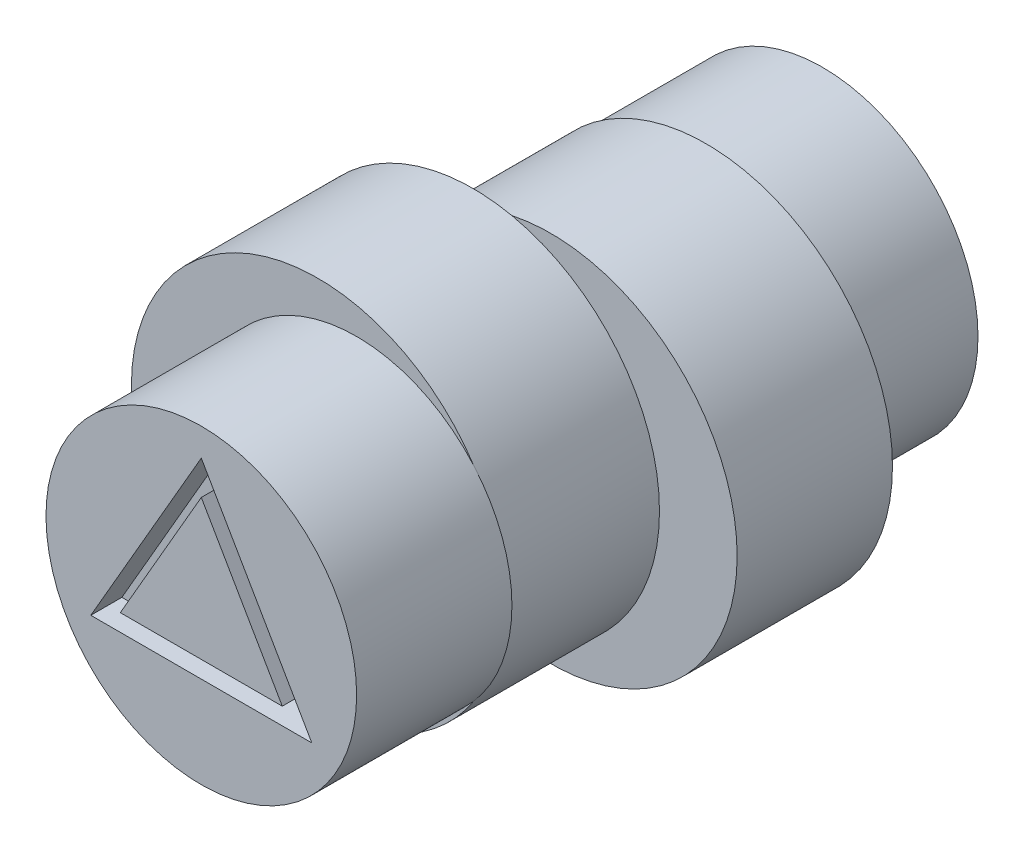
ISO-10303-21;
HEADER;
FILE_DESCRIPTION(('STEP AP214'),'2;1');
FILE_NAME('part.step','',(''),(''),'','','');
FILE_SCHEMA(('AUTOMOTIVE_DESIGN { 1 0 10303 214 1 1 1 1 }'));
ENDSEC;
DATA;
#1=APPLICATION_CONTEXT('core data for automotive mechanical design processes');
#2=APPLICATION_PROTOCOL_DEFINITION('international standard','automotive_design',2000,#1);
#3=PRODUCT_CONTEXT('',#1,'mechanical');
#4=PRODUCT('Part','Part','',(#3));
#5=PRODUCT_RELATED_PRODUCT_CATEGORY('part','',(#4));
#6=PRODUCT_DEFINITION_FORMATION('','',#4);
#7=PRODUCT_DEFINITION_CONTEXT('part definition',#1,'design');
#8=PRODUCT_DEFINITION('design','',#6,#7);
#9=PRODUCT_DEFINITION_SHAPE('','',#8);
#10=(LENGTH_UNIT() NAMED_UNIT(*) SI_UNIT(.MILLI.,.METRE.));
#11=(NAMED_UNIT(*) PLANE_ANGLE_UNIT() SI_UNIT($,.RADIAN.));
#12=(NAMED_UNIT(*) SI_UNIT($,.STERADIAN.) SOLID_ANGLE_UNIT());
#13=UNCERTAINTY_MEASURE_WITH_UNIT(LENGTH_MEASURE(1.E-05),#10,'distance_accuracy_value','');
#14=(GEOMETRIC_REPRESENTATION_CONTEXT(3) GLOBAL_UNCERTAINTY_ASSIGNED_CONTEXT((#13)) GLOBAL_UNIT_ASSIGNED_CONTEXT((#10,
#11,#12)) REPRESENTATION_CONTEXT('',''));
#15=CARTESIAN_POINT('',(0.,0.,0.));
#16=DIRECTION('',(0.,0.,1.));
#17=DIRECTION('',(1.,0.,0.));
#18=AXIS2_PLACEMENT_3D('',#15,#16,#17);
#19=CARTESIAN_POINT('',(2.,1.5,-1142.42938155235));
#20=DIRECTION('',(-1.,0.,0.));
#21=DIRECTION('',(0.,0.,1.));
#22=AXIS2_PLACEMENT_3D('',#19,#20,#21);
#23=PLANE('',#22);
#24=DIRECTION('',(0.,0.,-1.));
#25=VECTOR('',#24,1.);
#26=CARTESIAN_POINT('',(2.,-1.5,-1142.42938155235));
#27=LINE('',#26,#25);
#28=CARTESIAN_POINT('',(2.,-1.5,-1146.18226519916));
#29=VERTEX_POINT('',#28);
#30=CARTESIAN_POINT('',(2.,-1.5,-1161.58226519916));
#31=VERTEX_POINT('',#30);
#32=EDGE_CURVE('E211',#29,#31,#27,.T.);
#33=ORIENTED_EDGE('',*,*,#32,.F.);
#34=DIRECTION('',(0.,1.,0.));
#35=VECTOR('',#34,1.);
#36=CARTESIAN_POINT('',(2.,1.5,-1146.18226519916));
#37=LINE('',#36,#35);
#38=CARTESIAN_POINT('',(2.,1.5,-1146.18226519916));
#39=VERTEX_POINT('',#38);
#40=EDGE_CURVE('E173',#29,#39,#37,.T.);
#41=ORIENTED_EDGE('',*,*,#40,.T.);
#42=DIRECTION('',(0.,0.,-1.));
#43=VECTOR('',#42,1.);
#44=CARTESIAN_POINT('',(2.,1.5,-1142.42938155235));
#45=LINE('',#44,#43);
#46=CARTESIAN_POINT('',(2.,1.5,-1161.58226519916));
#47=VERTEX_POINT('',#46);
#48=EDGE_CURVE('E209',#39,#47,#45,.T.);
#49=ORIENTED_EDGE('',*,*,#48,.T.);
#50=DIRECTION('',(0.,1.,0.));
#51=VECTOR('',#50,1.);
#52=CARTESIAN_POINT('',(2.,1.5,-1161.58226519916));
#53=LINE('',#52,#51);
#54=EDGE_CURVE('E206',#31,#47,#53,.T.);
#55=ORIENTED_EDGE('',*,*,#54,.F.);
#56=EDGE_LOOP('',(#33,#41,#49,#55));
#57=FACE_BOUND('',#56,.T.);
#58=ADVANCED_FACE('F39',(#57),#23,.T.);
#59=CARTESIAN_POINT('',(0.,0.,-1142.42938155235));
#60=DIRECTION('',(0.,0.,-1.));
#61=DIRECTION('',(-1.,0.,0.));
#62=AXIS2_PLACEMENT_3D('',#59,#60,#61);
#63=CYLINDRICAL_SURFACE('',#62,2.5);
#64=ORIENTED_EDGE('',*,*,#48,.F.);
#65=CARTESIAN_POINT('',(0.,0.,-1146.18226519916));
#66=DIRECTION('',(0.,0.,1.));
#67=DIRECTION('',(1.,0.,0.));
#68=AXIS2_PLACEMENT_3D('',#65,#66,#67);
#69=CIRCLE('',#68,2.5);
#70=EDGE_CURVE('E11',#39,#29,#69,.T.);
#71=ORIENTED_EDGE('',*,*,#70,.T.);
#72=ORIENTED_EDGE('',*,*,#32,.T.);
#73=CARTESIAN_POINT('',(0.,0.,-1161.58226519916));
#74=DIRECTION('',(0.,0.,1.));
#75=DIRECTION('',(1.,0.,0.));
#76=AXIS2_PLACEMENT_3D('',#73,#74,#75);
#77=CIRCLE('',#76,2.5);
#78=EDGE_CURVE('E196',#47,#31,#77,.T.);
#79=ORIENTED_EDGE('',*,*,#78,.F.);
#80=EDGE_LOOP('',(#64,#71,#72,#79));
#81=FACE_BOUND('',#80,.T.);
#82=ADVANCED_FACE('F230',(#81),#63,.F.);
#83=CARTESIAN_POINT('',(0.,0.,-1142.42938155235));
#84=DIRECTION('',(0.,0.,-1.));
#85=DIRECTION('',(-1.,0.,0.));
#86=AXIS2_PLACEMENT_3D('',#83,#84,#85);
#87=CYLINDRICAL_SURFACE('',#86,5.00380000000014);
#88=CARTESIAN_POINT('',(0.,0.,-1161.58226519916));
#89=DIRECTION('',(0.,0.,1.));
#90=DIRECTION('',(1.,0.,0.));
#91=AXIS2_PLACEMENT_3D('',#88,#89,#90);
#92=CIRCLE('',#91,5.00380000000014);
#93=CARTESIAN_POINT('',(5.00380000000014,0.,-1161.58226519916));
#94=VERTEX_POINT('',#93);
#95=EDGE_CURVE('E212',#94,#94,#92,.T.);
#96=ORIENTED_EDGE('',*,*,#95,.T.);
#97=EDGE_LOOP('',(#96));
#98=FACE_BOUND('',#97,.T.);
#99=CARTESIAN_POINT('',(0.,0.,-1156.58226519916));
#100=DIRECTION('',(0.,0.,1.));
#101=DIRECTION('',(1.,0.,0.));
#102=AXIS2_PLACEMENT_3D('',#99,#100,#101);
#103=CIRCLE('',#102,5.00380000000014);
#104=CARTESIAN_POINT('',(-3.75979422399943,3.30181190154466,-1156.58226519916));
#105=VERTEX_POINT('',#104);
#106=CARTESIAN_POINT('',(-3.75979422399943,-3.30181190154466,-1156.58226519916));
#107=VERTEX_POINT('',#106);
#108=EDGE_CURVE('E201',#105,#107,#103,.T.);
#109=ORIENTED_EDGE('',*,*,#108,.F.);
#110=EDGE_CURVE('E203',#107,#105,#103,.T.);
#111=ORIENTED_EDGE('',*,*,#110,.F.);
#112=EDGE_LOOP('',(#109,#111));
#113=FACE_BOUND('',#112,.T.);
#114=ADVANCED_FACE('F41',(#98,#113),#87,.T.);
#115=CARTESIAN_POINT('',(0.,0.,-1161.58226519916));
#116=DIRECTION('',(0.,0.,1.));
#117=DIRECTION('',(1.,0.,0.));
#118=AXIS2_PLACEMENT_3D('',#115,#116,#117);
#119=PLANE('',#118);
#120=ORIENTED_EDGE('',*,*,#95,.F.);
#121=EDGE_LOOP('',(#120));
#122=FACE_BOUND('',#121,.T.);
#123=ORIENTED_EDGE('',*,*,#78,.T.);
#124=ORIENTED_EDGE('',*,*,#54,.T.);
#125=EDGE_LOOP('',(#123,#124));
#126=FACE_BOUND('',#125,.T.);
#127=ADVANCED_FACE('F229',(#122,#126),#119,.F.);
#128=CARTESIAN_POINT('',(0.,0.,-1156.58226519916));
#129=DIRECTION('',(0.,0.,1.));
#130=DIRECTION('',(-0.50000000000001,0.866025403784433,0.));
#131=AXIS2_PLACEMENT_3D('',#128,#129,#130);
#132=PLANE('',#131);
#133=CARTESIAN_POINT('',(1.25,0.,-1156.58226519916));
#134=DIRECTION('',(0.,0.,1.));
#135=DIRECTION('',(1.,0.,0.));
#136=AXIS2_PLACEMENT_3D('',#133,#134,#135);
#137=CIRCLE('',#136,6.);
#138=EDGE_CURVE('E198',#105,#107,#137,.T.);
#139=ORIENTED_EDGE('',*,*,#138,.F.);
#140=ORIENTED_EDGE('',*,*,#108,.T.);
#141=EDGE_LOOP('',(#139,#140));
#142=FACE_BOUND('',#141,.T.);
#143=ADVANCED_FACE('F227',(#142),#132,.T.);
#144=CARTESIAN_POINT('',(1.25,0.,-1156.58226519916));
#145=DIRECTION('',(0.,0.,1.));
#146=DIRECTION('',(1.,0.,0.));
#147=AXIS2_PLACEMENT_3D('',#144,#145,#146);
#148=PLANE('',#147);
#149=EDGE_CURVE('E189',#107,#105,#137,.T.);
#150=ORIENTED_EDGE('',*,*,#149,.F.);
#151=ORIENTED_EDGE('',*,*,#110,.T.);
#152=EDGE_LOOP('',(#150,#151));
#153=FACE_BOUND('',#152,.T.);
#154=ADVANCED_FACE('F221',(#153),#148,.F.);
#155=CARTESIAN_POINT('',(1.25,0.,-1151.58226519916));
#156=DIRECTION('',(0.,0.,1.));
#157=DIRECTION('',(1.,0.,0.));
#158=AXIS2_PLACEMENT_3D('',#155,#156,#157);
#159=PLANE('',#158);
#160=CARTESIAN_POINT('',(-1.25,0.,-1151.58226519916));
#161=DIRECTION('',(0.,0.,1.));
#162=DIRECTION('',(1.,0.,0.));
#163=AXIS2_PLACEMENT_3D('',#160,#161,#162);
#164=CIRCLE('',#163,6.);
#165=CARTESIAN_POINT('',(0.,-5.86834729715275,-1151.58226519916));
#166=VERTEX_POINT('',#165);
#167=CARTESIAN_POINT('',(0.,5.86834729715275,-1151.58226519916));
#168=VERTEX_POINT('',#167);
#169=EDGE_CURVE('E47',#166,#168,#164,.T.);
#170=ORIENTED_EDGE('',*,*,#169,.F.);
#171=CARTESIAN_POINT('',(1.25,0.,-1151.58226519916));
#172=DIRECTION('',(0.,0.,1.));
#173=DIRECTION('',(1.,0.,0.));
#174=AXIS2_PLACEMENT_3D('',#171,#172,#173);
#175=CIRCLE('',#174,6.);
#176=EDGE_CURVE('E197',#166,#168,#175,.T.);
#177=ORIENTED_EDGE('',*,*,#176,.T.);
#178=EDGE_LOOP('',(#170,#177));
#179=FACE_BOUND('',#178,.T.);
#180=ADVANCED_FACE('F251',(#179),#159,.T.);
#181=CARTESIAN_POINT('',(1.25,0.,-1151.58226519916));
#182=DIRECTION('',(0.,0.,-1.));
#183=DIRECTION('',(-1.,0.,0.));
#184=AXIS2_PLACEMENT_3D('',#181,#182,#183);
#185=CYLINDRICAL_SURFACE('',#184,6.);
#186=EDGE_CURVE('E193',#168,#166,#175,.T.);
#187=ORIENTED_EDGE('',*,*,#186,.F.);
#188=ORIENTED_EDGE('',*,*,#176,.F.);
#189=EDGE_LOOP('',(#187,#188));
#190=FACE_BOUND('',#189,.T.);
#191=ORIENTED_EDGE('',*,*,#138,.T.);
#192=ORIENTED_EDGE('',*,*,#149,.T.);
#193=EDGE_LOOP('',(#191,#192));
#194=FACE_BOUND('',#193,.T.);
#195=ADVANCED_FACE('F225',(#190,#194),#185,.T.);
#196=CARTESIAN_POINT('',(-1.25,0.,-1151.58226519916));
#197=DIRECTION('',(0.,0.,1.));
#198=DIRECTION('',(1.,0.,0.));
#199=AXIS2_PLACEMENT_3D('',#196,#197,#198);
#200=PLANE('',#199);
#201=EDGE_CURVE('E183',#168,#166,#164,.T.);
#202=ORIENTED_EDGE('',*,*,#201,.F.);
#203=ORIENTED_EDGE('',*,*,#186,.T.);
#204=EDGE_LOOP('',(#202,#203));
#205=FACE_BOUND('',#204,.T.);
#206=ADVANCED_FACE('F250',(#205),#200,.F.);
#207=CARTESIAN_POINT('',(-1.25,0.,-1146.58226519916));
#208=DIRECTION('',(0.,0.,1.));
#209=DIRECTION('',(1.,0.,0.));
#210=AXIS2_PLACEMENT_3D('',#207,#208,#209);
#211=PLANE('',#210);
#212=CARTESIAN_POINT('',(0.,0.,-1146.58226519916));
#213=DIRECTION('',(0.,0.,1.));
#214=DIRECTION('',(1.,0.,0.));
#215=AXIS2_PLACEMENT_3D('',#212,#213,#214);
#216=CIRCLE('',#215,5.);
#217=CARTESIAN_POINT('',(3.775,3.27862394915916,-1146.58226519916));
#218=VERTEX_POINT('',#217);
#219=CARTESIAN_POINT('',(3.775,-3.27862394915916,-1146.58226519916));
#220=VERTEX_POINT('',#219);
#221=EDGE_CURVE('E184',#218,#220,#216,.T.);
#222=ORIENTED_EDGE('',*,*,#221,.F.);
#223=CARTESIAN_POINT('',(-1.25,0.,-1146.58226519916));
#224=DIRECTION('',(0.,0.,1.));
#225=DIRECTION('',(1.,0.,0.));
#226=AXIS2_PLACEMENT_3D('',#223,#224,#225);
#227=CIRCLE('',#226,6.);
#228=EDGE_CURVE('E187',#218,#220,#227,.T.);
#229=ORIENTED_EDGE('',*,*,#228,.T.);
#230=EDGE_LOOP('',(#222,#229));
#231=FACE_BOUND('',#230,.T.);
#232=ADVANCED_FACE('F262',(#231),#211,.T.);
#233=CARTESIAN_POINT('',(-1.25,0.,-1146.58226519916));
#234=DIRECTION('',(0.,0.,-1.));
#235=DIRECTION('',(-1.,0.,0.));
#236=AXIS2_PLACEMENT_3D('',#233,#234,#235);
#237=CYLINDRICAL_SURFACE('',#236,6.);
#238=ORIENTED_EDGE('',*,*,#228,.F.);
#239=EDGE_CURVE('E190',#220,#218,#227,.T.);
#240=ORIENTED_EDGE('',*,*,#239,.F.);
#241=EDGE_LOOP('',(#238,#240));
#242=FACE_BOUND('',#241,.T.);
#243=ORIENTED_EDGE('',*,*,#201,.T.);
#244=ORIENTED_EDGE('',*,*,#169,.T.);
#245=EDGE_LOOP('',(#243,#244));
#246=FACE_BOUND('',#245,.T.);
#247=ADVANCED_FACE('F258',(#242,#246),#237,.T.);
#248=CARTESIAN_POINT('',(0.,0.,-1146.58226519916));
#249=DIRECTION('',(0.,0.,1.));
#250=DIRECTION('',(1.,0.,0.));
#251=AXIS2_PLACEMENT_3D('',#248,#249,#250);
#252=PLANE('',#251);
#253=EDGE_CURVE('E179',#220,#218,#216,.T.);
#254=ORIENTED_EDGE('',*,*,#253,.F.);
#255=ORIENTED_EDGE('',*,*,#239,.T.);
#256=EDGE_LOOP('',(#254,#255));
#257=FACE_BOUND('',#256,.T.);
#258=ADVANCED_FACE('F261',(#257),#252,.F.);
#259=CARTESIAN_POINT('',(0.,0.,-1141.58226519916));
#260=DIRECTION('',(0.,0.,1.));
#261=DIRECTION('',(1.,0.,0.));
#262=AXIS2_PLACEMENT_3D('',#259,#260,#261);
#263=PLANE('',#262);
#264=DIRECTION('',(-0.500000000000004,0.866025403784436,0.));
#265=VECTOR('',#264,1.);
#266=CARTESIAN_POINT('',(3.55727786160005,-2.05379533097704,-1141.58226519916));
#267=LINE('',#266,#265);
#268=CARTESIAN_POINT('',(3.55727786160005,-2.05379533097704,-1141.58226519916));
#269=VERTEX_POINT('',#268);
#270=CARTESIAN_POINT('',(0.,4.10759066195415,-1141.58226519916));
#271=VERTEX_POINT('',#270);
#272=EDGE_CURVE('E54',#269,#271,#267,.T.);
#273=ORIENTED_EDGE('',*,*,#272,.F.);
#274=DIRECTION('',(1.,0.,0.));
#275=VECTOR('',#274,1.);
#276=CARTESIAN_POINT('',(-3.55727786160002,-2.05379533097709,-1141.58226519916));
#277=LINE('',#276,#275);
#278=CARTESIAN_POINT('',(-3.55727786160002,-2.05379533097709,-1141.58226519916));
#279=VERTEX_POINT('',#278);
#280=EDGE_CURVE('E158',#279,#269,#277,.T.);
#281=ORIENTED_EDGE('',*,*,#280,.F.);
#282=DIRECTION('',(-0.499999999999998,-0.86602540378444,0.));
#283=VECTOR('',#282,1.);
#284=CARTESIAN_POINT('',(0.,4.10759066195415,-1141.58226519916));
#285=LINE('',#284,#283);
#286=EDGE_CURVE('E166',#271,#279,#285,.T.);
#287=ORIENTED_EDGE('',*,*,#286,.F.);
#288=EDGE_LOOP('',(#273,#281,#287));
#289=FACE_BOUND('',#288,.T.);
#290=CARTESIAN_POINT('',(0.,0.,-1141.58226519916));
#291=DIRECTION('',(0.,0.,1.));
#292=DIRECTION('',(1.,0.,0.));
#293=AXIS2_PLACEMENT_3D('',#290,#291,#292);
#294=CIRCLE('',#293,5.);
#295=CARTESIAN_POINT('',(5.,0.,-1141.58226519916));
#296=VERTEX_POINT('',#295);
#297=EDGE_CURVE('E180',#296,#296,#294,.T.);
#298=ORIENTED_EDGE('',*,*,#297,.T.);
#299=EDGE_LOOP('',(#298));
#300=FACE_BOUND('',#299,.T.);
#301=ADVANCED_FACE('F273',(#289,#300),#263,.T.);
#302=CARTESIAN_POINT('',(0.,0.,-1141.58226519916));
#303=DIRECTION('',(0.,0.,-1.));
#304=DIRECTION('',(-1.,0.,0.));
#305=AXIS2_PLACEMENT_3D('',#302,#303,#304);
#306=CYLINDRICAL_SURFACE('',#305,5.);
#307=ORIENTED_EDGE('',*,*,#297,.F.);
#308=EDGE_LOOP('',(#307));
#309=FACE_BOUND('',#308,.T.);
#310=ORIENTED_EDGE('',*,*,#221,.T.);
#311=ORIENTED_EDGE('',*,*,#253,.T.);
#312=EDGE_LOOP('',(#310,#311));
#313=FACE_BOUND('',#312,.T.);
#314=ADVANCED_FACE('F270',(#309,#313),#306,.T.);
#315=CARTESIAN_POINT('',(0.,0.,-1146.18226519916));
#316=DIRECTION('',(0.,0.,1.));
#317=DIRECTION('',(1.,0.,0.));
#318=AXIS2_PLACEMENT_3D('',#315,#316,#317);
#319=PLANE('',#318);
#320=ORIENTED_EDGE('',*,*,#40,.F.);
#321=ORIENTED_EDGE('',*,*,#70,.F.);
#322=EDGE_LOOP('',(#320,#321));
#323=FACE_BOUND('',#322,.T.);
#324=ADVANCED_FACE('F272',(#323),#319,.F.);
#325=CARTESIAN_POINT('',(3.55727786160005,-2.05379533097704,-1142.58226519916));
#326=DIRECTION('',(0.866025403784436,0.500000000000004,0.));
#327=DIRECTION('',(-0.500000000000004,0.866025403784436,0.));
#328=AXIS2_PLACEMENT_3D('',#325,#326,#327);
#329=PLANE('',#328);
#330=ORIENTED_EDGE('',*,*,#272,.T.);
#331=DIRECTION('',(0.,0.,1.));
#332=VECTOR('',#331,1.);
#333=CARTESIAN_POINT('',(0.,4.10759066195415,-1142.58226519916));
#334=LINE('',#333,#332);
#335=CARTESIAN_POINT('',(0.,4.10759066195415,-1142.58226519916));
#336=VERTEX_POINT('',#335);
#337=EDGE_CURVE('E164',#336,#271,#334,.T.);
#338=ORIENTED_EDGE('',*,*,#337,.F.);
#339=DIRECTION('',(-0.500000000000004,0.866025403784436,0.));
#340=VECTOR('',#339,1.);
#341=CARTESIAN_POINT('',(3.55727786160005,-2.05379533097704,-1142.58226519916));
#342=LINE('',#341,#340);
#343=CARTESIAN_POINT('',(3.55727786160005,-2.05379533097704,-1142.58226519916));
#344=VERTEX_POINT('',#343);
#345=EDGE_CURVE('E154',#344,#336,#342,.T.);
#346=ORIENTED_EDGE('',*,*,#345,.F.);
#347=DIRECTION('',(0.,0.,1.));
#348=VECTOR('',#347,1.);
#349=CARTESIAN_POINT('',(3.55727786160005,-2.05379533097704,-1142.58226519916));
#350=LINE('',#349,#348);
#351=EDGE_CURVE('E171',#344,#269,#350,.T.);
#352=ORIENTED_EDGE('',*,*,#351,.T.);
#353=EDGE_LOOP('',(#330,#338,#346,#352));
#354=FACE_BOUND('',#353,.T.);
#355=ADVANCED_FACE('F284',(#354),#329,.F.);
#356=CARTESIAN_POINT('',(-3.55727786160002,-2.05379533097709,-1142.58226519916));
#357=DIRECTION('',(0.,-1.,0.));
#358=DIRECTION('',(1.,0.,0.));
#359=AXIS2_PLACEMENT_3D('',#356,#357,#358);
#360=PLANE('',#359);
#361=ORIENTED_EDGE('',*,*,#280,.T.);
#362=ORIENTED_EDGE('',*,*,#351,.F.);
#363=DIRECTION('',(1.,0.,0.));
#364=VECTOR('',#363,1.);
#365=CARTESIAN_POINT('',(-3.55727786160002,-2.05379533097709,-1142.58226519916));
#366=LINE('',#365,#364);
#367=CARTESIAN_POINT('',(-3.55727786160002,-2.05379533097709,-1142.58226519916));
#368=VERTEX_POINT('',#367);
#369=EDGE_CURVE('E161',#368,#344,#366,.T.);
#370=ORIENTED_EDGE('',*,*,#369,.F.);
#371=DIRECTION('',(0.,0.,1.));
#372=VECTOR('',#371,1.);
#373=CARTESIAN_POINT('',(-3.55727786160002,-2.05379533097709,-1142.58226519916));
#374=LINE('',#373,#372);
#375=EDGE_CURVE('E174',#368,#279,#374,.T.);
#376=ORIENTED_EDGE('',*,*,#375,.T.);
#377=EDGE_LOOP('',(#361,#362,#370,#376));
#378=FACE_BOUND('',#377,.T.);
#379=ADVANCED_FACE('F288',(#378),#360,.F.);
#380=CARTESIAN_POINT('',(0.,4.10759066195415,-1142.58226519916));
#381=DIRECTION('',(-0.86602540378444,0.499999999999998,0.));
#382=DIRECTION('',(-0.499999999999998,-0.86602540378444,0.));
#383=AXIS2_PLACEMENT_3D('',#380,#381,#382);
#384=PLANE('',#383);
#385=ORIENTED_EDGE('',*,*,#286,.T.);
#386=ORIENTED_EDGE('',*,*,#375,.F.);
#387=DIRECTION('',(-0.499999999999998,-0.86602540378444,0.));
#388=VECTOR('',#387,1.);
#389=CARTESIAN_POINT('',(0.,4.10759066195415,-1142.58226519916));
#390=LINE('',#389,#388);
#391=EDGE_CURVE('E157',#336,#368,#390,.T.);
#392=ORIENTED_EDGE('',*,*,#391,.F.);
#393=ORIENTED_EDGE('',*,*,#337,.T.);
#394=EDGE_LOOP('',(#385,#386,#392,#393));
#395=FACE_BOUND('',#394,.T.);
#396=ADVANCED_FACE('F289',(#395),#384,.F.);
#397=CARTESIAN_POINT('',(0.,0.,-1142.58226519916));
#398=DIRECTION('',(0.,0.,1.));
#399=DIRECTION('',(1.,0.,0.));
#400=AXIS2_PLACEMENT_3D('',#397,#398,#399);
#401=PLANE('',#400);
#402=DIRECTION('',(1.,0.,0.));
#403=VECTOR('',#402,1.);
#404=CARTESIAN_POINT('',(-2.60721462643698,-1.50527606640853,-1142.58226519916));
#405=LINE('',#404,#403);
#406=CARTESIAN_POINT('',(-2.60721462643698,-1.50527606640853,-1142.58226519916));
#407=VERTEX_POINT('',#406);
#408=CARTESIAN_POINT('',(2.607214626437,-1.5052760664085,-1142.58226519916));
#409=VERTEX_POINT('',#408);
#410=EDGE_CURVE('E134',#407,#409,#405,.T.);
#411=ORIENTED_EDGE('',*,*,#410,.F.);
#412=DIRECTION('',(-0.499999999999998,-0.86602540378444,0.));
#413=VECTOR('',#412,1.);
#414=CARTESIAN_POINT('',(0.,3.01055213281704,-1142.58226519916));
#415=LINE('',#414,#413);
#416=CARTESIAN_POINT('',(0.,3.01055213281704,-1142.58226519916));
#417=VERTEX_POINT('',#416);
#418=EDGE_CURVE('E126',#417,#407,#415,.T.);
#419=ORIENTED_EDGE('',*,*,#418,.F.);
#420=DIRECTION('',(-0.500000000000004,0.866025403784436,0.));
#421=VECTOR('',#420,1.);
#422=CARTESIAN_POINT('',(2.607214626437,-1.5052760664085,-1142.58226519916));
#423=LINE('',#422,#421);
#424=EDGE_CURVE('E140',#409,#417,#423,.T.);
#425=ORIENTED_EDGE('',*,*,#424,.F.);
#426=EDGE_LOOP('',(#411,#419,#425));
#427=FACE_BOUND('',#426,.T.);
#428=ORIENTED_EDGE('',*,*,#345,.T.);
#429=ORIENTED_EDGE('',*,*,#391,.T.);
#430=ORIENTED_EDGE('',*,*,#369,.T.);
#431=EDGE_LOOP('',(#428,#429,#430));
#432=FACE_BOUND('',#431,.T.);
#433=ADVANCED_FACE('F138',(#427,#432),#401,.T.);
#434=CARTESIAN_POINT('',(2.607214626437,-1.5052760664085,-1142.58226519916));
#435=DIRECTION('',(0.866025403784436,0.500000000000004,0.));
#436=DIRECTION('',(-0.500000000000004,0.866025403784436,0.));
#437=AXIS2_PLACEMENT_3D('',#434,#435,#436);
#438=PLANE('',#437);
#439=DIRECTION('',(-0.500000000000004,0.866025403784436,0.));
#440=VECTOR('',#439,1.);
#441=CARTESIAN_POINT('',(2.607214626437,-1.5052760664085,-1141.58226519916));
#442=LINE('',#441,#440);
#443=CARTESIAN_POINT('',(2.607214626437,-1.5052760664085,-1141.58226519916));
#444=VERTEX_POINT('',#443);
#445=CARTESIAN_POINT('',(0.,3.01055213281704,-1141.58226519916));
#446=VERTEX_POINT('',#445);
#447=EDGE_CURVE('E149',#444,#446,#442,.T.);
#448=ORIENTED_EDGE('',*,*,#447,.F.);
#449=DIRECTION('',(0.,0.,1.));
#450=VECTOR('',#449,1.);
#451=CARTESIAN_POINT('',(2.607214626437,-1.5052760664085,-1142.58226519916));
#452=LINE('',#451,#450);
#453=EDGE_CURVE('E144',#409,#444,#452,.T.);
#454=ORIENTED_EDGE('',*,*,#453,.F.);
#455=ORIENTED_EDGE('',*,*,#424,.T.);
#456=DIRECTION('',(0.,0.,1.));
#457=VECTOR('',#456,1.);
#458=CARTESIAN_POINT('',(0.,3.01055213281704,-1142.58226519916));
#459=LINE('',#458,#457);
#460=EDGE_CURVE('E123',#417,#446,#459,.T.);
#461=ORIENTED_EDGE('',*,*,#460,.T.);
#462=EDGE_LOOP('',(#448,#454,#455,#461));
#463=FACE_BOUND('',#462,.T.);
#464=ADVANCED_FACE('F143',(#463),#438,.T.);
#465=CARTESIAN_POINT('',(-2.60721462643698,-1.50527606640853,-1142.58226519916));
#466=DIRECTION('',(0.,-1.,0.));
#467=DIRECTION('',(1.,0.,0.));
#468=AXIS2_PLACEMENT_3D('',#465,#466,#467);
#469=PLANE('',#468);
#470=DIRECTION('',(1.,0.,0.));
#471=VECTOR('',#470,1.);
#472=CARTESIAN_POINT('',(-2.60721462643698,-1.50527606640853,-1141.58226519916));
#473=LINE('',#472,#471);
#474=CARTESIAN_POINT('',(-2.60721462643698,-1.50527606640853,-1141.58226519916));
#475=VERTEX_POINT('',#474);
#476=EDGE_CURVE('E62',#475,#444,#473,.T.);
#477=ORIENTED_EDGE('',*,*,#476,.F.);
#478=DIRECTION('',(0.,0.,1.));
#479=VECTOR('',#478,1.);
#480=CARTESIAN_POINT('',(-2.60721462643698,-1.50527606640853,-1142.58226519916));
#481=LINE('',#480,#479);
#482=EDGE_CURVE('E133',#407,#475,#481,.T.);
#483=ORIENTED_EDGE('',*,*,#482,.F.);
#484=ORIENTED_EDGE('',*,*,#410,.T.);
#485=ORIENTED_EDGE('',*,*,#453,.T.);
#486=EDGE_LOOP('',(#477,#483,#484,#485));
#487=FACE_BOUND('',#486,.T.);
#488=ADVANCED_FACE('F300',(#487),#469,.T.);
#489=CARTESIAN_POINT('',(0.,3.01055213281704,-1142.58226519916));
#490=DIRECTION('',(-0.86602540378444,0.499999999999998,0.));
#491=DIRECTION('',(-0.499999999999998,-0.86602540378444,0.));
#492=AXIS2_PLACEMENT_3D('',#489,#490,#491);
#493=PLANE('',#492);
#494=DIRECTION('',(-0.499999999999998,-0.86602540378444,0.));
#495=VECTOR('',#494,1.);
#496=CARTESIAN_POINT('',(0.,3.01055213281704,-1141.58226519916));
#497=LINE('',#496,#495);
#498=EDGE_CURVE('E128',#446,#475,#497,.T.);
#499=ORIENTED_EDGE('',*,*,#498,.F.);
#500=ORIENTED_EDGE('',*,*,#460,.F.);
#501=ORIENTED_EDGE('',*,*,#418,.T.);
#502=ORIENTED_EDGE('',*,*,#482,.T.);
#503=EDGE_LOOP('',(#499,#500,#501,#502));
#504=FACE_BOUND('',#503,.T.);
#505=ADVANCED_FACE('F125',(#504),#493,.T.);
#506=ORIENTED_EDGE('',*,*,#476,.T.);
#507=ORIENTED_EDGE('',*,*,#447,.T.);
#508=ORIENTED_EDGE('',*,*,#498,.T.);
#509=EDGE_LOOP('',(#506,#507,#508));
#510=FACE_BOUND('',#509,.T.);
#511=ADVANCED_FACE('F281',(#510),#263,.T.);
#512=CLOSED_SHELL('',(#58,#82,#114,#127,#143,#154,#180,#195,#206,#232,#247,#258,#301,#314,#324,
#355,#379,#396,#433,#464,#488,#505,#511));
#513=MANIFOLD_SOLID_BREP('B2',#512);
#514=ADVANCED_BREP_SHAPE_REPRESENTATION('',(#18,#513),#14);
#515=SHAPE_DEFINITION_REPRESENTATION(#9,#514);
ENDSEC;
END-ISO-10303-21;
